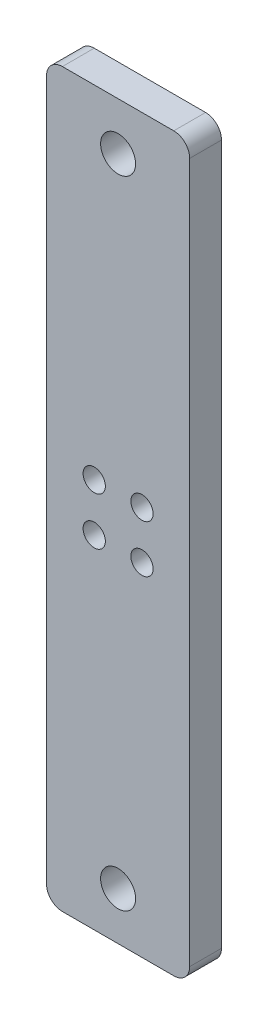
ISO-10303-21;
HEADER;
FILE_DESCRIPTION(('STEP AP214'),'2;1');
FILE_NAME('part.step','',(''),(''),'','','');
FILE_SCHEMA(('AUTOMOTIVE_DESIGN { 1 0 10303 214 1 1 1 1 }'));
ENDSEC;
DATA;
#1=APPLICATION_CONTEXT('core data for automotive mechanical design processes');
#2=APPLICATION_PROTOCOL_DEFINITION('international standard','automotive_design',2000,#1);
#3=PRODUCT_CONTEXT('',#1,'mechanical');
#4=PRODUCT('Part','Part','',(#3));
#5=PRODUCT_RELATED_PRODUCT_CATEGORY('part','',(#4));
#6=PRODUCT_DEFINITION_FORMATION('','',#4);
#7=PRODUCT_DEFINITION_CONTEXT('part definition',#1,'design');
#8=PRODUCT_DEFINITION('design','',#6,#7);
#9=PRODUCT_DEFINITION_SHAPE('','',#8);
#10=(LENGTH_UNIT() NAMED_UNIT(*) SI_UNIT(.MILLI.,.METRE.));
#11=(NAMED_UNIT(*) PLANE_ANGLE_UNIT() SI_UNIT($,.RADIAN.));
#12=(NAMED_UNIT(*) SI_UNIT($,.STERADIAN.) SOLID_ANGLE_UNIT());
#13=UNCERTAINTY_MEASURE_WITH_UNIT(LENGTH_MEASURE(1.E-05),#10,'distance_accuracy_value','');
#14=(GEOMETRIC_REPRESENTATION_CONTEXT(3) GLOBAL_UNCERTAINTY_ASSIGNED_CONTEXT((#13)) GLOBAL_UNIT_ASSIGNED_CONTEXT((#10,
#11,#12)) REPRESENTATION_CONTEXT('',''));
#15=CARTESIAN_POINT('',(0.,0.,0.));
#16=DIRECTION('',(0.,0.,1.));
#17=DIRECTION('',(1.,0.,0.));
#18=AXIS2_PLACEMENT_3D('',#15,#16,#17);
#19=CARTESIAN_POINT('',(22.5,115.,-10.));
#20=DIRECTION('',(1.,0.,0.));
#21=DIRECTION('',(0.,1.,0.));
#22=AXIS2_PLACEMENT_3D('',#19,#20,#21);
#23=PLANE('',#22);
#24=DIRECTION('',(0.,1.,0.));
#25=VECTOR('',#24,1.);
#26=CARTESIAN_POINT('',(22.5,115.,-10.));
#27=LINE('',#26,#25);
#28=CARTESIAN_POINT('',(22.5,-110.,-10.));
#29=VERTEX_POINT('',#28);
#30=CARTESIAN_POINT('',(22.5,110.,-10.));
#31=VERTEX_POINT('',#30);
#32=EDGE_CURVE('E170',#29,#31,#27,.T.);
#33=ORIENTED_EDGE('',*,*,#32,.T.);
#34=DIRECTION('',(0.,0.,1.));
#35=VECTOR('',#34,1.);
#36=CARTESIAN_POINT('',(22.5,110.,-10.));
#37=LINE('',#36,#35);
#38=CARTESIAN_POINT('',(22.5,110.,0.));
#39=VERTEX_POINT('',#38);
#40=EDGE_CURVE('E125',#31,#39,#37,.T.);
#41=ORIENTED_EDGE('',*,*,#40,.T.);
#42=DIRECTION('',(0.,1.,0.));
#43=VECTOR('',#42,1.);
#44=CARTESIAN_POINT('',(22.5,115.,0.));
#45=LINE('',#44,#43);
#46=CARTESIAN_POINT('',(22.5,-110.,0.));
#47=VERTEX_POINT('',#46);
#48=EDGE_CURVE('E110',#47,#39,#45,.T.);
#49=ORIENTED_EDGE('',*,*,#48,.F.);
#50=DIRECTION('',(0.,0.,1.));
#51=VECTOR('',#50,1.);
#52=CARTESIAN_POINT('',(22.5,-110.,-10.));
#53=LINE('',#52,#51);
#54=EDGE_CURVE('E122',#47,#29,#53,.F.);
#55=ORIENTED_EDGE('',*,*,#54,.T.);
#56=EDGE_LOOP('',(#33,#41,#49,#55));
#57=FACE_BOUND('',#56,.T.);
#58=ADVANCED_FACE('F40',(#57),#23,.T.);
#59=CARTESIAN_POINT('',(-22.5,-115.,-10.));
#60=DIRECTION('',(0.,-1.,0.));
#61=DIRECTION('',(0.,0.,-1.));
#62=AXIS2_PLACEMENT_3D('',#59,#60,#61);
#63=PLANE('',#62);
#64=DIRECTION('',(1.,0.,0.));
#65=VECTOR('',#64,1.);
#66=CARTESIAN_POINT('',(-22.5,-115.,-10.));
#67=LINE('',#66,#65);
#68=CARTESIAN_POINT('',(-17.5,-115.,-10.));
#69=VERTEX_POINT('',#68);
#70=CARTESIAN_POINT('',(17.5,-115.,-10.));
#71=VERTEX_POINT('',#70);
#72=EDGE_CURVE('E132',#69,#71,#67,.T.);
#73=ORIENTED_EDGE('',*,*,#72,.T.);
#74=DIRECTION('',(0.,0.,1.));
#75=VECTOR('',#74,1.);
#76=CARTESIAN_POINT('',(17.5,-115.,-10.));
#77=LINE('',#76,#75);
#78=CARTESIAN_POINT('',(17.5,-115.,0.));
#79=VERTEX_POINT('',#78);
#80=EDGE_CURVE('E11',#71,#79,#77,.T.);
#81=ORIENTED_EDGE('',*,*,#80,.T.);
#82=DIRECTION('',(1.,0.,0.));
#83=VECTOR('',#82,1.);
#84=CARTESIAN_POINT('',(-22.5,-115.,0.));
#85=LINE('',#84,#83);
#86=CARTESIAN_POINT('',(-17.5,-115.,0.));
#87=VERTEX_POINT('',#86);
#88=EDGE_CURVE('E112',#87,#79,#85,.T.);
#89=ORIENTED_EDGE('',*,*,#88,.F.);
#90=DIRECTION('',(0.,0.,1.));
#91=VECTOR('',#90,1.);
#92=CARTESIAN_POINT('',(-17.5,-115.,-10.));
#93=LINE('',#92,#91);
#94=EDGE_CURVE('E48',#87,#69,#93,.F.);
#95=ORIENTED_EDGE('',*,*,#94,.T.);
#96=EDGE_LOOP('',(#73,#81,#89,#95));
#97=FACE_BOUND('',#96,.T.);
#98=ADVANCED_FACE('F161',(#97),#63,.T.);
#99=CARTESIAN_POINT('',(-22.5,115.,-10.));
#100=DIRECTION('',(-1.,0.,0.));
#101=DIRECTION('',(0.,-1.,0.));
#102=AXIS2_PLACEMENT_3D('',#99,#100,#101);
#103=PLANE('',#102);
#104=DIRECTION('',(0.,-1.,0.));
#105=VECTOR('',#104,1.);
#106=CARTESIAN_POINT('',(-22.5,115.,0.));
#107=LINE('',#106,#105);
#108=CARTESIAN_POINT('',(-22.5,110.,0.));
#109=VERTEX_POINT('',#108);
#110=CARTESIAN_POINT('',(-22.5,-110.,0.));
#111=VERTEX_POINT('',#110);
#112=EDGE_CURVE('E168',#109,#111,#107,.T.);
#113=ORIENTED_EDGE('',*,*,#112,.F.);
#114=DIRECTION('',(0.,0.,1.));
#115=VECTOR('',#114,1.);
#116=CARTESIAN_POINT('',(-22.5,110.,-10.));
#117=LINE('',#116,#115);
#118=CARTESIAN_POINT('',(-22.5,110.,-10.));
#119=VERTEX_POINT('',#118);
#120=EDGE_CURVE('E62',#109,#119,#117,.F.);
#121=ORIENTED_EDGE('',*,*,#120,.T.);
#122=DIRECTION('',(0.,-1.,0.));
#123=VECTOR('',#122,1.);
#124=CARTESIAN_POINT('',(-22.5,115.,-10.));
#125=LINE('',#124,#123);
#126=CARTESIAN_POINT('',(-22.5,-110.,-10.));
#127=VERTEX_POINT('',#126);
#128=EDGE_CURVE('E136',#119,#127,#125,.T.);
#129=ORIENTED_EDGE('',*,*,#128,.T.);
#130=DIRECTION('',(0.,0.,1.));
#131=VECTOR('',#130,1.);
#132=CARTESIAN_POINT('',(-22.5,-110.,-10.));
#133=LINE('',#132,#131);
#134=EDGE_CURVE('E156',#127,#111,#133,.T.);
#135=ORIENTED_EDGE('',*,*,#134,.T.);
#136=EDGE_LOOP('',(#113,#121,#129,#135));
#137=FACE_BOUND('',#136,.T.);
#138=ADVANCED_FACE('F167',(#137),#103,.T.);
#139=CARTESIAN_POINT('',(-22.5,115.,-10.));
#140=DIRECTION('',(0.,1.,0.));
#141=DIRECTION('',(0.,0.,1.));
#142=AXIS2_PLACEMENT_3D('',#139,#140,#141);
#143=PLANE('',#142);
#144=DIRECTION('',(-1.,0.,0.));
#145=VECTOR('',#144,1.);
#146=CARTESIAN_POINT('',(-22.5,115.,0.));
#147=LINE('',#146,#145);
#148=CARTESIAN_POINT('',(17.5,115.,0.));
#149=VERTEX_POINT('',#148);
#150=CARTESIAN_POINT('',(-17.5,115.,0.));
#151=VERTEX_POINT('',#150);
#152=EDGE_CURVE('E126',#149,#151,#147,.T.);
#153=ORIENTED_EDGE('',*,*,#152,.F.);
#154=DIRECTION('',(0.,0.,1.));
#155=VECTOR('',#154,1.);
#156=CARTESIAN_POINT('',(17.5,115.,-10.));
#157=LINE('',#156,#155);
#158=CARTESIAN_POINT('',(17.5,115.,-10.));
#159=VERTEX_POINT('',#158);
#160=EDGE_CURVE('E148',#149,#159,#157,.F.);
#161=ORIENTED_EDGE('',*,*,#160,.T.);
#162=DIRECTION('',(-1.,0.,0.));
#163=VECTOR('',#162,1.);
#164=CARTESIAN_POINT('',(-22.5,115.,-10.));
#165=LINE('',#164,#163);
#166=CARTESIAN_POINT('',(-17.5,115.,-10.));
#167=VERTEX_POINT('',#166);
#168=EDGE_CURVE('E174',#159,#167,#165,.T.);
#169=ORIENTED_EDGE('',*,*,#168,.T.);
#170=DIRECTION('',(0.,0.,1.));
#171=VECTOR('',#170,1.);
#172=CARTESIAN_POINT('',(-17.5,115.,-10.));
#173=LINE('',#172,#171);
#174=EDGE_CURVE('E145',#167,#151,#173,.T.);
#175=ORIENTED_EDGE('',*,*,#174,.T.);
#176=EDGE_LOOP('',(#153,#161,#169,#175));
#177=FACE_BOUND('',#176,.T.);
#178=ADVANCED_FACE('F245',(#177),#143,.T.);
#179=CARTESIAN_POINT('',(0.,0.,-10.));
#180=DIRECTION('',(0.,0.,1.));
#181=DIRECTION('',(1.,0.,0.));
#182=AXIS2_PLACEMENT_3D('',#179,#180,#181);
#183=PLANE('',#182);
#184=CARTESIAN_POINT('',(0.,-100.,-10.));
#185=DIRECTION('',(0.,0.,1.));
#186=DIRECTION('',(1.,0.,0.));
#187=AXIS2_PLACEMENT_3D('',#184,#185,#186);
#188=CIRCLE('',#187,5.5);
#189=CARTESIAN_POINT('',(5.5,-100.,-10.));
#190=VERTEX_POINT('',#189);
#191=EDGE_CURVE('E201',#190,#190,#188,.T.);
#192=ORIENTED_EDGE('',*,*,#191,.T.);
#193=EDGE_LOOP('',(#192));
#194=FACE_BOUND('',#193,.T.);
#195=CARTESIAN_POINT('',(0.,100.,-10.));
#196=DIRECTION('',(0.,0.,1.));
#197=DIRECTION('',(1.,0.,0.));
#198=AXIS2_PLACEMENT_3D('',#195,#196,#197);
#199=CIRCLE('',#198,5.5);
#200=CARTESIAN_POINT('',(5.5,100.,-10.));
#201=VERTEX_POINT('',#200);
#202=EDGE_CURVE('E205',#201,#201,#199,.T.);
#203=ORIENTED_EDGE('',*,*,#202,.T.);
#204=EDGE_LOOP('',(#203));
#205=FACE_BOUND('',#204,.T.);
#206=CARTESIAN_POINT('',(-7.5,7.5,-10.));
#207=DIRECTION('',(0.,0.,1.));
#208=DIRECTION('',(1.,0.,0.));
#209=AXIS2_PLACEMENT_3D('',#206,#207,#208);
#210=CIRCLE('',#209,3.5);
#211=CARTESIAN_POINT('',(-4.,7.5,-10.));
#212=VERTEX_POINT('',#211);
#213=EDGE_CURVE('E127',#212,#212,#210,.T.);
#214=ORIENTED_EDGE('',*,*,#213,.T.);
#215=EDGE_LOOP('',(#214));
#216=FACE_BOUND('',#215,.T.);
#217=CARTESIAN_POINT('',(7.5,-7.5,-10.));
#218=DIRECTION('',(0.,0.,1.));
#219=DIRECTION('',(1.,0.,0.));
#220=AXIS2_PLACEMENT_3D('',#217,#218,#219);
#221=CIRCLE('',#220,3.5);
#222=CARTESIAN_POINT('',(11.,-7.5,-10.));
#223=VERTEX_POINT('',#222);
#224=EDGE_CURVE('E180',#223,#223,#221,.T.);
#225=ORIENTED_EDGE('',*,*,#224,.T.);
#226=EDGE_LOOP('',(#225));
#227=FACE_BOUND('',#226,.T.);
#228=CARTESIAN_POINT('',(-7.5,-7.5,-10.));
#229=DIRECTION('',(0.,0.,1.));
#230=DIRECTION('',(1.,0.,0.));
#231=AXIS2_PLACEMENT_3D('',#228,#229,#230);
#232=CIRCLE('',#231,3.5);
#233=CARTESIAN_POINT('',(-4.,-7.5,-10.));
#234=VERTEX_POINT('',#233);
#235=EDGE_CURVE('E183',#234,#234,#232,.T.);
#236=ORIENTED_EDGE('',*,*,#235,.T.);
#237=EDGE_LOOP('',(#236));
#238=FACE_BOUND('',#237,.T.);
#239=CARTESIAN_POINT('',(7.5,7.5,-10.));
#240=DIRECTION('',(0.,0.,1.));
#241=DIRECTION('',(1.,0.,0.));
#242=AXIS2_PLACEMENT_3D('',#239,#240,#241);
#243=CIRCLE('',#242,3.5);
#244=CARTESIAN_POINT('',(11.,7.5,-10.));
#245=VERTEX_POINT('',#244);
#246=EDGE_CURVE('E186',#245,#245,#243,.T.);
#247=ORIENTED_EDGE('',*,*,#246,.T.);
#248=EDGE_LOOP('',(#247));
#249=FACE_BOUND('',#248,.T.);
#250=ORIENTED_EDGE('',*,*,#168,.F.);
#251=CARTESIAN_POINT('',(17.5,110.,-10.));
#252=DIRECTION('',(0.,0.,1.));
#253=DIRECTION('',(1.,0.,0.));
#254=AXIS2_PLACEMENT_3D('',#251,#252,#253);
#255=CIRCLE('',#254,5.);
#256=EDGE_CURVE('E154',#159,#31,#255,.F.);
#257=ORIENTED_EDGE('',*,*,#256,.T.);
#258=ORIENTED_EDGE('',*,*,#32,.F.);
#259=CARTESIAN_POINT('',(17.5,-110.,-10.));
#260=DIRECTION('',(0.,0.,1.));
#261=DIRECTION('',(1.,0.,0.));
#262=AXIS2_PLACEMENT_3D('',#259,#260,#261);
#263=CIRCLE('',#262,5.);
#264=EDGE_CURVE('E131',#29,#71,#263,.F.);
#265=ORIENTED_EDGE('',*,*,#264,.T.);
#266=ORIENTED_EDGE('',*,*,#72,.F.);
#267=CARTESIAN_POINT('',(-17.5,-110.,-10.));
#268=DIRECTION('',(0.,0.,1.));
#269=DIRECTION('',(1.,0.,0.));
#270=AXIS2_PLACEMENT_3D('',#267,#268,#269);
#271=CIRCLE('',#270,5.);
#272=EDGE_CURVE('E55',#69,#127,#271,.F.);
#273=ORIENTED_EDGE('',*,*,#272,.T.);
#274=ORIENTED_EDGE('',*,*,#128,.F.);
#275=CARTESIAN_POINT('',(-17.5,110.,-10.));
#276=DIRECTION('',(0.,0.,1.));
#277=DIRECTION('',(1.,0.,0.));
#278=AXIS2_PLACEMENT_3D('',#275,#276,#277);
#279=CIRCLE('',#278,5.);
#280=EDGE_CURVE('E152',#119,#167,#279,.F.);
#281=ORIENTED_EDGE('',*,*,#280,.T.);
#282=EDGE_LOOP('',(#250,#257,#258,#265,#266,#273,#274,#281));
#283=FACE_BOUND('',#282,.T.);
#284=ADVANCED_FACE('F164',(#194,#205,#216,#227,#238,#249,#283),#183,.F.);
#285=CARTESIAN_POINT('',(0.,0.,0.));
#286=DIRECTION('',(0.,0.,1.));
#287=DIRECTION('',(1.,0.,0.));
#288=AXIS2_PLACEMENT_3D('',#285,#286,#287);
#289=PLANE('',#288);
#290=CARTESIAN_POINT('',(0.,-100.,0.));
#291=DIRECTION('',(0.,0.,1.));
#292=DIRECTION('',(1.,0.,0.));
#293=AXIS2_PLACEMENT_3D('',#290,#291,#292);
#294=CIRCLE('',#293,5.5);
#295=CARTESIAN_POINT('',(5.5,-100.,0.));
#296=VERTEX_POINT('',#295);
#297=EDGE_CURVE('E208',#296,#296,#294,.T.);
#298=ORIENTED_EDGE('',*,*,#297,.F.);
#299=EDGE_LOOP('',(#298));
#300=FACE_BOUND('',#299,.T.);
#301=CARTESIAN_POINT('',(0.,100.,0.));
#302=DIRECTION('',(0.,0.,1.));
#303=DIRECTION('',(1.,0.,0.));
#304=AXIS2_PLACEMENT_3D('',#301,#302,#303);
#305=CIRCLE('',#304,5.5);
#306=CARTESIAN_POINT('',(5.5,100.,0.));
#307=VERTEX_POINT('',#306);
#308=EDGE_CURVE('E202',#307,#307,#305,.T.);
#309=ORIENTED_EDGE('',*,*,#308,.F.);
#310=EDGE_LOOP('',(#309));
#311=FACE_BOUND('',#310,.T.);
#312=CARTESIAN_POINT('',(-7.5,7.5,0.));
#313=DIRECTION('',(0.,0.,1.));
#314=DIRECTION('',(1.,0.,0.));
#315=AXIS2_PLACEMENT_3D('',#312,#313,#314);
#316=CIRCLE('',#315,3.5);
#317=CARTESIAN_POINT('',(-4.,7.5,0.));
#318=VERTEX_POINT('',#317);
#319=EDGE_CURVE('E192',#318,#318,#316,.T.);
#320=ORIENTED_EDGE('',*,*,#319,.F.);
#321=EDGE_LOOP('',(#320));
#322=FACE_BOUND('',#321,.T.);
#323=CARTESIAN_POINT('',(7.5,-7.5,0.));
#324=DIRECTION('',(0.,0.,1.));
#325=DIRECTION('',(1.,0.,0.));
#326=AXIS2_PLACEMENT_3D('',#323,#324,#325);
#327=CIRCLE('',#326,3.5);
#328=CARTESIAN_POINT('',(11.,-7.5,0.));
#329=VERTEX_POINT('',#328);
#330=EDGE_CURVE('E193',#329,#329,#327,.T.);
#331=ORIENTED_EDGE('',*,*,#330,.F.);
#332=EDGE_LOOP('',(#331));
#333=FACE_BOUND('',#332,.T.);
#334=CARTESIAN_POINT('',(-7.5,-7.5,0.));
#335=DIRECTION('',(0.,0.,1.));
#336=DIRECTION('',(1.,0.,0.));
#337=AXIS2_PLACEMENT_3D('',#334,#335,#336);
#338=CIRCLE('',#337,3.5);
#339=CARTESIAN_POINT('',(-4.,-7.5,0.));
#340=VERTEX_POINT('',#339);
#341=EDGE_CURVE('E196',#340,#340,#338,.T.);
#342=ORIENTED_EDGE('',*,*,#341,.F.);
#343=EDGE_LOOP('',(#342));
#344=FACE_BOUND('',#343,.T.);
#345=CARTESIAN_POINT('',(7.5,7.5,0.));
#346=DIRECTION('',(0.,0.,1.));
#347=DIRECTION('',(1.,0.,0.));
#348=AXIS2_PLACEMENT_3D('',#345,#346,#347);
#349=CIRCLE('',#348,3.5);
#350=CARTESIAN_POINT('',(11.,7.5,0.));
#351=VERTEX_POINT('',#350);
#352=EDGE_CURVE('E189',#351,#351,#349,.T.);
#353=ORIENTED_EDGE('',*,*,#352,.F.);
#354=EDGE_LOOP('',(#353));
#355=FACE_BOUND('',#354,.T.);
#356=ORIENTED_EDGE('',*,*,#48,.T.);
#357=CARTESIAN_POINT('',(17.5,110.,0.));
#358=DIRECTION('',(0.,0.,1.));
#359=DIRECTION('',(1.,0.,0.));
#360=AXIS2_PLACEMENT_3D('',#357,#358,#359);
#361=CIRCLE('',#360,5.);
#362=EDGE_CURVE('E143',#39,#149,#361,.T.);
#363=ORIENTED_EDGE('',*,*,#362,.T.);
#364=ORIENTED_EDGE('',*,*,#152,.T.);
#365=CARTESIAN_POINT('',(-17.5,110.,0.));
#366=DIRECTION('',(0.,0.,1.));
#367=DIRECTION('',(1.,0.,0.));
#368=AXIS2_PLACEMENT_3D('',#365,#366,#367);
#369=CIRCLE('',#368,5.);
#370=EDGE_CURVE('E116',#151,#109,#369,.T.);
#371=ORIENTED_EDGE('',*,*,#370,.T.);
#372=ORIENTED_EDGE('',*,*,#112,.T.);
#373=CARTESIAN_POINT('',(-17.5,-110.,0.));
#374=DIRECTION('',(0.,0.,1.));
#375=DIRECTION('',(1.,0.,0.));
#376=AXIS2_PLACEMENT_3D('',#373,#374,#375);
#377=CIRCLE('',#376,5.);
#378=EDGE_CURVE('E117',#111,#87,#377,.T.);
#379=ORIENTED_EDGE('',*,*,#378,.T.);
#380=ORIENTED_EDGE('',*,*,#88,.T.);
#381=CARTESIAN_POINT('',(17.5,-110.,0.));
#382=DIRECTION('',(0.,0.,1.));
#383=DIRECTION('',(1.,0.,0.));
#384=AXIS2_PLACEMENT_3D('',#381,#382,#383);
#385=CIRCLE('',#384,5.);
#386=EDGE_CURVE('E107',#79,#47,#385,.T.);
#387=ORIENTED_EDGE('',*,*,#386,.T.);
#388=EDGE_LOOP('',(#356,#363,#364,#371,#372,#379,#380,#387));
#389=FACE_BOUND('',#388,.T.);
#390=ADVANCED_FACE('F109',(#300,#311,#322,#333,#344,#355,#389),#289,.T.);
#391=CARTESIAN_POINT('',(7.5,7.5,-26.));
#392=DIRECTION('',(0.,0.,1.));
#393=DIRECTION('',(1.,0.,0.));
#394=AXIS2_PLACEMENT_3D('',#391,#392,#393);
#395=CYLINDRICAL_SURFACE('',#394,3.5);
#396=CARTESIAN_POINT('',(11.,7.5,0.));
#397=CARTESIAN_POINT('',(11.,7.5,-0.10416666666667));
#398=CARTESIAN_POINT('',(11.,7.5,-0.208333333333337));
#399=CARTESIAN_POINT('',(11.,7.5,-0.416666666666671));
#400=CARTESIAN_POINT('',(11.,7.5,-0.520833333333337));
#401=CARTESIAN_POINT('',(11.,7.5,-0.729166666666671));
#402=CARTESIAN_POINT('',(11.,7.5,-0.833333333333337));
#403=CARTESIAN_POINT('',(11.,7.5,-1.04166666666667));
#404=CARTESIAN_POINT('',(11.,7.5,-1.14583333333334));
#405=CARTESIAN_POINT('',(11.,7.5,-1.35416666666667));
#406=CARTESIAN_POINT('',(11.,7.5,-1.45833333333334));
#407=CARTESIAN_POINT('',(11.,7.5,-1.66666666666667));
#408=CARTESIAN_POINT('',(11.,7.5,-1.77083333333334));
#409=CARTESIAN_POINT('',(11.,7.5,-1.97916666666667));
#410=CARTESIAN_POINT('',(11.,7.5,-2.08333333333334));
#411=CARTESIAN_POINT('',(11.,7.5,-2.29166666666667));
#412=CARTESIAN_POINT('',(11.,7.5,-2.39583333333334));
#413=CARTESIAN_POINT('',(11.,7.5,-2.60416666666667));
#414=CARTESIAN_POINT('',(11.,7.5,-2.70833333333334));
#415=CARTESIAN_POINT('',(11.,7.5,-2.91666666666667));
#416=CARTESIAN_POINT('',(11.,7.5,-3.02083333333334));
#417=CARTESIAN_POINT('',(11.,7.5,-3.22916666666667));
#418=CARTESIAN_POINT('',(11.,7.5,-3.33333333333334));
#419=CARTESIAN_POINT('',(11.,7.5,-3.54166666666667));
#420=CARTESIAN_POINT('',(11.,7.5,-3.64583333333334));
#421=CARTESIAN_POINT('',(11.,7.5,-3.85416666666667));
#422=CARTESIAN_POINT('',(11.,7.5,-3.95833333333334));
#423=CARTESIAN_POINT('',(11.,7.5,-4.16666666666667));
#424=CARTESIAN_POINT('',(11.,7.5,-4.27083333333334));
#425=CARTESIAN_POINT('',(11.,7.5,-4.47916666666667));
#426=CARTESIAN_POINT('',(11.,7.5,-4.58333333333334));
#427=CARTESIAN_POINT('',(11.,7.5,-4.79166666666667));
#428=CARTESIAN_POINT('',(11.,7.5,-4.89583333333334));
#429=CARTESIAN_POINT('',(11.,7.5,-5.10416666666667));
#430=CARTESIAN_POINT('',(11.,7.5,-5.20833333333334));
#431=CARTESIAN_POINT('',(11.,7.5,-5.41666666666667));
#432=CARTESIAN_POINT('',(11.,7.5,-5.52083333333334));
#433=CARTESIAN_POINT('',(11.,7.5,-5.72916666666667));
#434=CARTESIAN_POINT('',(11.,7.5,-5.83333333333334));
#435=CARTESIAN_POINT('',(11.,7.5,-6.04166666666667));
#436=CARTESIAN_POINT('',(11.,7.5,-6.14583333333334));
#437=CARTESIAN_POINT('',(11.,7.5,-6.35416666666667));
#438=CARTESIAN_POINT('',(11.,7.5,-6.45833333333334));
#439=CARTESIAN_POINT('',(11.,7.5,-6.66666666666667));
#440=CARTESIAN_POINT('',(11.,7.5,-6.77083333333334));
#441=CARTESIAN_POINT('',(11.,7.5,-6.97916666666667));
#442=CARTESIAN_POINT('',(11.,7.5,-7.08333333333334));
#443=CARTESIAN_POINT('',(11.,7.5,-7.29166666666667));
#444=CARTESIAN_POINT('',(11.,7.5,-7.39583333333334));
#445=CARTESIAN_POINT('',(11.,7.5,-7.60416666666667));
#446=CARTESIAN_POINT('',(11.,7.5,-7.70833333333334));
#447=CARTESIAN_POINT('',(11.,7.5,-7.91666666666667));
#448=CARTESIAN_POINT('',(11.,7.5,-8.02083333333334));
#449=CARTESIAN_POINT('',(11.,7.5,-8.22916666666667));
#450=CARTESIAN_POINT('',(11.,7.5,-8.33333333333334));
#451=CARTESIAN_POINT('',(11.,7.5,-8.54166666666667));
#452=CARTESIAN_POINT('',(11.,7.5,-8.64583333333334));
#453=CARTESIAN_POINT('',(11.,7.5,-8.85416666666667));
#454=CARTESIAN_POINT('',(11.,7.5,-8.95833333333334));
#455=CARTESIAN_POINT('',(11.,7.5,-9.16666666666667));
#456=CARTESIAN_POINT('',(11.,7.5,-9.27083333333334));
#457=CARTESIAN_POINT('',(11.,7.5,-9.47916666666667));
#458=CARTESIAN_POINT('',(11.,7.5,-9.58333333333334));
#459=CARTESIAN_POINT('',(11.,7.5,-9.79166666666667));
#460=CARTESIAN_POINT('',(11.,7.5,-9.89583333333334));
#461=CARTESIAN_POINT('',(11.,7.5,-10.));
#462=B_SPLINE_CURVE_WITH_KNOTS('',3,(#396,#397,#398,#399,#400,#401,#402,#403,#404,#405,#406,
#407,#408,#409,#410,#411,#412,#413,#414,#415,#416,#417,#418,#419,#420,#421,#422,#423,#424,#425,
#426,#427,#428,#429,#430,#431,#432,#433,#434,#435,#436,#437,#438,#439,#440,#441,#442,#443,#444,
#445,#446,#447,#448,#449,#450,#451,#452,#453,#454,#455,#456,#457,#458,#459,#460,#461),
.UNSPECIFIED.,.F.,.F.,(4,2,2,2,2,2,2,2,2,2,2,2,2,2,2,2,2,2,2,2,2,2,2,2,2,2,2,2,2,2,2,2,4),(0.,
0.3125,0.625000000000001,0.937500000000001,1.25,1.5625,1.875,2.1875,2.5,2.8125,3.125,3.4375,
3.75,4.0625,4.375,4.6875,5.,5.3125,5.625,5.9375,6.25,6.5625,6.875,7.1875,7.5,7.8125,8.125,
8.4375,8.75,9.0625,9.375,9.6875,10.),.UNSPECIFIED.);
#463=EDGE_CURVE('BSEAM226',#351,#245,#462,.T.);
#464=ORIENTED_EDGE('',*,*,#352,.T.);
#465=ORIENTED_EDGE('',*,*,#246,.F.);
#466=ORIENTED_EDGE('',*,*,#463,.T.);
#467=ORIENTED_EDGE('',*,*,#463,.F.);
#468=EDGE_LOOP('',(#464,#466,#465,#467));
#469=FACE_BOUND('',#468,.T.);
#470=ADVANCED_FACE('F226',(#469),#395,.F.);
#471=CARTESIAN_POINT('',(-7.5,-7.5,-26.));
#472=DIRECTION('',(0.,0.,1.));
#473=DIRECTION('',(1.,0.,0.));
#474=AXIS2_PLACEMENT_3D('',#471,#472,#473);
#475=CYLINDRICAL_SURFACE('',#474,3.5);
#476=CARTESIAN_POINT('',(-4.,-7.5,0.));
#477=CARTESIAN_POINT('',(-4.,-7.5,-0.10416666666667));
#478=CARTESIAN_POINT('',(-4.,-7.5,-0.208333333333337));
#479=CARTESIAN_POINT('',(-4.,-7.5,-0.416666666666671));
#480=CARTESIAN_POINT('',(-4.,-7.5,-0.520833333333337));
#481=CARTESIAN_POINT('',(-4.,-7.5,-0.729166666666671));
#482=CARTESIAN_POINT('',(-4.,-7.5,-0.833333333333337));
#483=CARTESIAN_POINT('',(-4.,-7.5,-1.04166666666667));
#484=CARTESIAN_POINT('',(-4.,-7.5,-1.14583333333334));
#485=CARTESIAN_POINT('',(-4.,-7.5,-1.35416666666667));
#486=CARTESIAN_POINT('',(-4.,-7.5,-1.45833333333334));
#487=CARTESIAN_POINT('',(-4.,-7.5,-1.66666666666667));
#488=CARTESIAN_POINT('',(-4.,-7.5,-1.77083333333334));
#489=CARTESIAN_POINT('',(-4.,-7.5,-1.97916666666667));
#490=CARTESIAN_POINT('',(-4.,-7.5,-2.08333333333334));
#491=CARTESIAN_POINT('',(-4.,-7.5,-2.29166666666667));
#492=CARTESIAN_POINT('',(-4.,-7.5,-2.39583333333334));
#493=CARTESIAN_POINT('',(-4.,-7.5,-2.60416666666667));
#494=CARTESIAN_POINT('',(-4.,-7.5,-2.70833333333334));
#495=CARTESIAN_POINT('',(-4.,-7.5,-2.91666666666667));
#496=CARTESIAN_POINT('',(-4.,-7.5,-3.02083333333334));
#497=CARTESIAN_POINT('',(-4.,-7.5,-3.22916666666667));
#498=CARTESIAN_POINT('',(-4.,-7.5,-3.33333333333334));
#499=CARTESIAN_POINT('',(-4.,-7.5,-3.54166666666667));
#500=CARTESIAN_POINT('',(-4.,-7.5,-3.64583333333334));
#501=CARTESIAN_POINT('',(-4.,-7.5,-3.85416666666667));
#502=CARTESIAN_POINT('',(-4.,-7.5,-3.95833333333334));
#503=CARTESIAN_POINT('',(-4.,-7.5,-4.16666666666667));
#504=CARTESIAN_POINT('',(-4.,-7.5,-4.27083333333334));
#505=CARTESIAN_POINT('',(-4.,-7.5,-4.47916666666667));
#506=CARTESIAN_POINT('',(-4.,-7.5,-4.58333333333334));
#507=CARTESIAN_POINT('',(-4.,-7.5,-4.79166666666667));
#508=CARTESIAN_POINT('',(-4.,-7.5,-4.89583333333334));
#509=CARTESIAN_POINT('',(-4.,-7.5,-5.10416666666667));
#510=CARTESIAN_POINT('',(-4.,-7.5,-5.20833333333334));
#511=CARTESIAN_POINT('',(-4.,-7.5,-5.41666666666667));
#512=CARTESIAN_POINT('',(-4.,-7.5,-5.52083333333334));
#513=CARTESIAN_POINT('',(-4.,-7.5,-5.72916666666667));
#514=CARTESIAN_POINT('',(-4.,-7.5,-5.83333333333334));
#515=CARTESIAN_POINT('',(-4.,-7.5,-6.04166666666667));
#516=CARTESIAN_POINT('',(-4.,-7.5,-6.14583333333334));
#517=CARTESIAN_POINT('',(-4.,-7.5,-6.35416666666667));
#518=CARTESIAN_POINT('',(-4.,-7.5,-6.45833333333334));
#519=CARTESIAN_POINT('',(-4.,-7.5,-6.66666666666667));
#520=CARTESIAN_POINT('',(-4.,-7.5,-6.77083333333334));
#521=CARTESIAN_POINT('',(-4.,-7.5,-6.97916666666667));
#522=CARTESIAN_POINT('',(-4.,-7.5,-7.08333333333334));
#523=CARTESIAN_POINT('',(-4.,-7.5,-7.29166666666667));
#524=CARTESIAN_POINT('',(-4.,-7.5,-7.39583333333334));
#525=CARTESIAN_POINT('',(-4.,-7.5,-7.60416666666667));
#526=CARTESIAN_POINT('',(-4.,-7.5,-7.70833333333334));
#527=CARTESIAN_POINT('',(-4.,-7.5,-7.91666666666667));
#528=CARTESIAN_POINT('',(-4.,-7.5,-8.02083333333334));
#529=CARTESIAN_POINT('',(-4.,-7.5,-8.22916666666667));
#530=CARTESIAN_POINT('',(-4.,-7.5,-8.33333333333334));
#531=CARTESIAN_POINT('',(-4.,-7.5,-8.54166666666667));
#532=CARTESIAN_POINT('',(-4.,-7.5,-8.64583333333334));
#533=CARTESIAN_POINT('',(-4.,-7.5,-8.85416666666667));
#534=CARTESIAN_POINT('',(-4.,-7.5,-8.95833333333334));
#535=CARTESIAN_POINT('',(-4.,-7.5,-9.16666666666667));
#536=CARTESIAN_POINT('',(-4.,-7.5,-9.27083333333334));
#537=CARTESIAN_POINT('',(-4.,-7.5,-9.47916666666667));
#538=CARTESIAN_POINT('',(-4.,-7.5,-9.58333333333334));
#539=CARTESIAN_POINT('',(-4.,-7.5,-9.79166666666667));
#540=CARTESIAN_POINT('',(-4.,-7.5,-9.89583333333334));
#541=CARTESIAN_POINT('',(-4.,-7.5,-10.));
#542=B_SPLINE_CURVE_WITH_KNOTS('',3,(#476,#477,#478,#479,#480,#481,#482,#483,#484,#485,#486,
#487,#488,#489,#490,#491,#492,#493,#494,#495,#496,#497,#498,#499,#500,#501,#502,#503,#504,#505,
#506,#507,#508,#509,#510,#511,#512,#513,#514,#515,#516,#517,#518,#519,#520,#521,#522,#523,#524,
#525,#526,#527,#528,#529,#530,#531,#532,#533,#534,#535,#536,#537,#538,#539,#540,#541),
.UNSPECIFIED.,.F.,.F.,(4,2,2,2,2,2,2,2,2,2,2,2,2,2,2,2,2,2,2,2,2,2,2,2,2,2,2,2,2,2,2,2,4),(0.,
0.3125,0.625000000000001,0.937500000000001,1.25,1.5625,1.875,2.1875,2.5,2.8125,3.125,3.4375,
3.75,4.0625,4.375,4.6875,5.,5.3125,5.625,5.9375,6.25,6.5625,6.875,7.1875,7.5,7.8125,8.125,
8.4375,8.75,9.0625,9.375,9.6875,10.),.UNSPECIFIED.);
#543=EDGE_CURVE('BSEAM240',#340,#234,#542,.T.);
#544=ORIENTED_EDGE('',*,*,#341,.T.);
#545=ORIENTED_EDGE('',*,*,#235,.F.);
#546=ORIENTED_EDGE('',*,*,#543,.T.);
#547=ORIENTED_EDGE('',*,*,#543,.F.);
#548=EDGE_LOOP('',(#544,#546,#545,#547));
#549=FACE_BOUND('',#548,.T.);
#550=ADVANCED_FACE('F240',(#549),#475,.F.);
#551=CARTESIAN_POINT('',(7.5,-7.5,-26.));
#552=DIRECTION('',(0.,0.,1.));
#553=DIRECTION('',(1.,0.,0.));
#554=AXIS2_PLACEMENT_3D('',#551,#552,#553);
#555=CYLINDRICAL_SURFACE('',#554,3.5);
#556=CARTESIAN_POINT('',(11.,-7.5,0.));
#557=CARTESIAN_POINT('',(11.,-7.5,-0.10416666666667));
#558=CARTESIAN_POINT('',(11.,-7.5,-0.208333333333337));
#559=CARTESIAN_POINT('',(11.,-7.5,-0.416666666666671));
#560=CARTESIAN_POINT('',(11.,-7.5,-0.520833333333337));
#561=CARTESIAN_POINT('',(11.,-7.5,-0.729166666666671));
#562=CARTESIAN_POINT('',(11.,-7.5,-0.833333333333337));
#563=CARTESIAN_POINT('',(11.,-7.5,-1.04166666666667));
#564=CARTESIAN_POINT('',(11.,-7.5,-1.14583333333334));
#565=CARTESIAN_POINT('',(11.,-7.5,-1.35416666666667));
#566=CARTESIAN_POINT('',(11.,-7.5,-1.45833333333334));
#567=CARTESIAN_POINT('',(11.,-7.5,-1.66666666666667));
#568=CARTESIAN_POINT('',(11.,-7.5,-1.77083333333334));
#569=CARTESIAN_POINT('',(11.,-7.5,-1.97916666666667));
#570=CARTESIAN_POINT('',(11.,-7.5,-2.08333333333334));
#571=CARTESIAN_POINT('',(11.,-7.5,-2.29166666666667));
#572=CARTESIAN_POINT('',(11.,-7.5,-2.39583333333334));
#573=CARTESIAN_POINT('',(11.,-7.5,-2.60416666666667));
#574=CARTESIAN_POINT('',(11.,-7.5,-2.70833333333334));
#575=CARTESIAN_POINT('',(11.,-7.5,-2.91666666666667));
#576=CARTESIAN_POINT('',(11.,-7.5,-3.02083333333334));
#577=CARTESIAN_POINT('',(11.,-7.5,-3.22916666666667));
#578=CARTESIAN_POINT('',(11.,-7.5,-3.33333333333334));
#579=CARTESIAN_POINT('',(11.,-7.5,-3.54166666666667));
#580=CARTESIAN_POINT('',(11.,-7.5,-3.64583333333334));
#581=CARTESIAN_POINT('',(11.,-7.5,-3.85416666666667));
#582=CARTESIAN_POINT('',(11.,-7.5,-3.95833333333334));
#583=CARTESIAN_POINT('',(11.,-7.5,-4.16666666666667));
#584=CARTESIAN_POINT('',(11.,-7.5,-4.27083333333334));
#585=CARTESIAN_POINT('',(11.,-7.5,-4.47916666666667));
#586=CARTESIAN_POINT('',(11.,-7.5,-4.58333333333334));
#587=CARTESIAN_POINT('',(11.,-7.5,-4.79166666666667));
#588=CARTESIAN_POINT('',(11.,-7.5,-4.89583333333334));
#589=CARTESIAN_POINT('',(11.,-7.5,-5.10416666666667));
#590=CARTESIAN_POINT('',(11.,-7.5,-5.20833333333334));
#591=CARTESIAN_POINT('',(11.,-7.5,-5.41666666666667));
#592=CARTESIAN_POINT('',(11.,-7.5,-5.52083333333334));
#593=CARTESIAN_POINT('',(11.,-7.5,-5.72916666666667));
#594=CARTESIAN_POINT('',(11.,-7.5,-5.83333333333334));
#595=CARTESIAN_POINT('',(11.,-7.5,-6.04166666666667));
#596=CARTESIAN_POINT('',(11.,-7.5,-6.14583333333334));
#597=CARTESIAN_POINT('',(11.,-7.5,-6.35416666666667));
#598=CARTESIAN_POINT('',(11.,-7.5,-6.45833333333334));
#599=CARTESIAN_POINT('',(11.,-7.5,-6.66666666666667));
#600=CARTESIAN_POINT('',(11.,-7.5,-6.77083333333334));
#601=CARTESIAN_POINT('',(11.,-7.5,-6.97916666666667));
#602=CARTESIAN_POINT('',(11.,-7.5,-7.08333333333334));
#603=CARTESIAN_POINT('',(11.,-7.5,-7.29166666666667));
#604=CARTESIAN_POINT('',(11.,-7.5,-7.39583333333334));
#605=CARTESIAN_POINT('',(11.,-7.5,-7.60416666666667));
#606=CARTESIAN_POINT('',(11.,-7.5,-7.70833333333334));
#607=CARTESIAN_POINT('',(11.,-7.5,-7.91666666666667));
#608=CARTESIAN_POINT('',(11.,-7.5,-8.02083333333334));
#609=CARTESIAN_POINT('',(11.,-7.5,-8.22916666666667));
#610=CARTESIAN_POINT('',(11.,-7.5,-8.33333333333334));
#611=CARTESIAN_POINT('',(11.,-7.5,-8.54166666666667));
#612=CARTESIAN_POINT('',(11.,-7.5,-8.64583333333334));
#613=CARTESIAN_POINT('',(11.,-7.5,-8.85416666666667));
#614=CARTESIAN_POINT('',(11.,-7.5,-8.95833333333334));
#615=CARTESIAN_POINT('',(11.,-7.5,-9.16666666666667));
#616=CARTESIAN_POINT('',(11.,-7.5,-9.27083333333334));
#617=CARTESIAN_POINT('',(11.,-7.5,-9.47916666666667));
#618=CARTESIAN_POINT('',(11.,-7.5,-9.58333333333334));
#619=CARTESIAN_POINT('',(11.,-7.5,-9.79166666666667));
#620=CARTESIAN_POINT('',(11.,-7.5,-9.89583333333334));
#621=CARTESIAN_POINT('',(11.,-7.5,-10.));
#622=B_SPLINE_CURVE_WITH_KNOTS('',3,(#556,#557,#558,#559,#560,#561,#562,#563,#564,#565,#566,
#567,#568,#569,#570,#571,#572,#573,#574,#575,#576,#577,#578,#579,#580,#581,#582,#583,#584,#585,
#586,#587,#588,#589,#590,#591,#592,#593,#594,#595,#596,#597,#598,#599,#600,#601,#602,#603,#604,
#605,#606,#607,#608,#609,#610,#611,#612,#613,#614,#615,#616,#617,#618,#619,#620,#621),
.UNSPECIFIED.,.F.,.F.,(4,2,2,2,2,2,2,2,2,2,2,2,2,2,2,2,2,2,2,2,2,2,2,2,2,2,2,2,2,2,2,2,4),(0.,
0.3125,0.625000000000001,0.937500000000001,1.25,1.5625,1.875,2.1875,2.5,2.8125,3.125,3.4375,
3.75,4.0625,4.375,4.6875,5.,5.3125,5.625,5.9375,6.25,6.5625,6.875,7.1875,7.5,7.8125,8.125,
8.4375,8.75,9.0625,9.375,9.6875,10.),.UNSPECIFIED.);
#623=EDGE_CURVE('BSEAM354',#329,#223,#622,.T.);
#624=ORIENTED_EDGE('',*,*,#330,.T.);
#625=ORIENTED_EDGE('',*,*,#224,.F.);
#626=ORIENTED_EDGE('',*,*,#623,.T.);
#627=ORIENTED_EDGE('',*,*,#623,.F.);
#628=EDGE_LOOP('',(#624,#626,#625,#627));
#629=FACE_BOUND('',#628,.T.);
#630=ADVANCED_FACE('F354',(#629),#555,.F.);
#631=CARTESIAN_POINT('',(-7.5,7.5,-26.));
#632=DIRECTION('',(0.,0.,1.));
#633=DIRECTION('',(1.,0.,0.));
#634=AXIS2_PLACEMENT_3D('',#631,#632,#633);
#635=CYLINDRICAL_SURFACE('',#634,3.5);
#636=CARTESIAN_POINT('',(-4.,7.5,0.));
#637=CARTESIAN_POINT('',(-4.,7.5,-0.10416666666667));
#638=CARTESIAN_POINT('',(-4.,7.5,-0.208333333333337));
#639=CARTESIAN_POINT('',(-4.,7.5,-0.416666666666671));
#640=CARTESIAN_POINT('',(-4.,7.5,-0.520833333333337));
#641=CARTESIAN_POINT('',(-4.,7.5,-0.729166666666671));
#642=CARTESIAN_POINT('',(-4.,7.5,-0.833333333333337));
#643=CARTESIAN_POINT('',(-4.,7.5,-1.04166666666667));
#644=CARTESIAN_POINT('',(-4.,7.5,-1.14583333333334));
#645=CARTESIAN_POINT('',(-4.,7.5,-1.35416666666667));
#646=CARTESIAN_POINT('',(-4.,7.5,-1.45833333333334));
#647=CARTESIAN_POINT('',(-4.,7.5,-1.66666666666667));
#648=CARTESIAN_POINT('',(-4.,7.5,-1.77083333333334));
#649=CARTESIAN_POINT('',(-4.,7.5,-1.97916666666667));
#650=CARTESIAN_POINT('',(-4.,7.5,-2.08333333333334));
#651=CARTESIAN_POINT('',(-4.,7.5,-2.29166666666667));
#652=CARTESIAN_POINT('',(-4.,7.5,-2.39583333333334));
#653=CARTESIAN_POINT('',(-4.,7.5,-2.60416666666667));
#654=CARTESIAN_POINT('',(-4.,7.5,-2.70833333333334));
#655=CARTESIAN_POINT('',(-4.,7.5,-2.91666666666667));
#656=CARTESIAN_POINT('',(-4.,7.5,-3.02083333333334));
#657=CARTESIAN_POINT('',(-4.,7.5,-3.22916666666667));
#658=CARTESIAN_POINT('',(-4.,7.5,-3.33333333333334));
#659=CARTESIAN_POINT('',(-4.,7.5,-3.54166666666667));
#660=CARTESIAN_POINT('',(-4.,7.5,-3.64583333333334));
#661=CARTESIAN_POINT('',(-4.,7.5,-3.85416666666667));
#662=CARTESIAN_POINT('',(-4.,7.5,-3.95833333333334));
#663=CARTESIAN_POINT('',(-4.,7.5,-4.16666666666667));
#664=CARTESIAN_POINT('',(-4.,7.5,-4.27083333333334));
#665=CARTESIAN_POINT('',(-4.,7.5,-4.47916666666667));
#666=CARTESIAN_POINT('',(-4.,7.5,-4.58333333333334));
#667=CARTESIAN_POINT('',(-4.,7.5,-4.79166666666667));
#668=CARTESIAN_POINT('',(-4.,7.5,-4.89583333333334));
#669=CARTESIAN_POINT('',(-4.,7.5,-5.10416666666667));
#670=CARTESIAN_POINT('',(-4.,7.5,-5.20833333333334));
#671=CARTESIAN_POINT('',(-4.,7.5,-5.41666666666667));
#672=CARTESIAN_POINT('',(-4.,7.5,-5.52083333333334));
#673=CARTESIAN_POINT('',(-4.,7.5,-5.72916666666667));
#674=CARTESIAN_POINT('',(-4.,7.5,-5.83333333333334));
#675=CARTESIAN_POINT('',(-4.,7.5,-6.04166666666667));
#676=CARTESIAN_POINT('',(-4.,7.5,-6.14583333333334));
#677=CARTESIAN_POINT('',(-4.,7.5,-6.35416666666667));
#678=CARTESIAN_POINT('',(-4.,7.5,-6.45833333333334));
#679=CARTESIAN_POINT('',(-4.,7.5,-6.66666666666667));
#680=CARTESIAN_POINT('',(-4.,7.5,-6.77083333333334));
#681=CARTESIAN_POINT('',(-4.,7.5,-6.97916666666667));
#682=CARTESIAN_POINT('',(-4.,7.5,-7.08333333333334));
#683=CARTESIAN_POINT('',(-4.,7.5,-7.29166666666667));
#684=CARTESIAN_POINT('',(-4.,7.5,-7.39583333333334));
#685=CARTESIAN_POINT('',(-4.,7.5,-7.60416666666667));
#686=CARTESIAN_POINT('',(-4.,7.5,-7.70833333333334));
#687=CARTESIAN_POINT('',(-4.,7.5,-7.91666666666667));
#688=CARTESIAN_POINT('',(-4.,7.5,-8.02083333333334));
#689=CARTESIAN_POINT('',(-4.,7.5,-8.22916666666667));
#690=CARTESIAN_POINT('',(-4.,7.5,-8.33333333333334));
#691=CARTESIAN_POINT('',(-4.,7.5,-8.54166666666667));
#692=CARTESIAN_POINT('',(-4.,7.5,-8.64583333333334));
#693=CARTESIAN_POINT('',(-4.,7.5,-8.85416666666667));
#694=CARTESIAN_POINT('',(-4.,7.5,-8.95833333333334));
#695=CARTESIAN_POINT('',(-4.,7.5,-9.16666666666667));
#696=CARTESIAN_POINT('',(-4.,7.5,-9.27083333333334));
#697=CARTESIAN_POINT('',(-4.,7.5,-9.47916666666667));
#698=CARTESIAN_POINT('',(-4.,7.5,-9.58333333333334));
#699=CARTESIAN_POINT('',(-4.,7.5,-9.79166666666667));
#700=CARTESIAN_POINT('',(-4.,7.5,-9.89583333333334));
#701=CARTESIAN_POINT('',(-4.,7.5,-10.));
#702=B_SPLINE_CURVE_WITH_KNOTS('',3,(#636,#637,#638,#639,#640,#641,#642,#643,#644,#645,#646,
#647,#648,#649,#650,#651,#652,#653,#654,#655,#656,#657,#658,#659,#660,#661,#662,#663,#664,#665,
#666,#667,#668,#669,#670,#671,#672,#673,#674,#675,#676,#677,#678,#679,#680,#681,#682,#683,#684,
#685,#686,#687,#688,#689,#690,#691,#692,#693,#694,#695,#696,#697,#698,#699,#700,#701),
.UNSPECIFIED.,.F.,.F.,(4,2,2,2,2,2,2,2,2,2,2,2,2,2,2,2,2,2,2,2,2,2,2,2,2,2,2,2,2,2,2,2,4),(0.,
0.3125,0.625000000000001,0.937500000000001,1.25,1.5625,1.875,2.1875,2.5,2.8125,3.125,3.4375,
3.75,4.0625,4.375,4.6875,5.,5.3125,5.625,5.9375,6.25,6.5625,6.875,7.1875,7.5,7.8125,8.125,
8.4375,8.75,9.0625,9.375,9.6875,10.),.UNSPECIFIED.);
#703=EDGE_CURVE('BSEAM344',#318,#212,#702,.T.);
#704=ORIENTED_EDGE('',*,*,#319,.T.);
#705=ORIENTED_EDGE('',*,*,#213,.F.);
#706=ORIENTED_EDGE('',*,*,#703,.T.);
#707=ORIENTED_EDGE('',*,*,#703,.F.);
#708=EDGE_LOOP('',(#704,#706,#705,#707));
#709=FACE_BOUND('',#708,.T.);
#710=ADVANCED_FACE('F344',(#709),#635,.F.);
#711=CARTESIAN_POINT('',(0.,100.,-10.));
#712=DIRECTION('',(0.,0.,1.));
#713=DIRECTION('',(1.,0.,0.));
#714=AXIS2_PLACEMENT_3D('',#711,#712,#713);
#715=CYLINDRICAL_SURFACE('',#714,5.5);
#716=ORIENTED_EDGE('',*,*,#202,.F.);
#717=EDGE_LOOP('',(#716));
#718=FACE_BOUND('',#717,.T.);
#719=ORIENTED_EDGE('',*,*,#308,.T.);
#720=EDGE_LOOP('',(#719));
#721=FACE_BOUND('',#720,.T.);
#722=ADVANCED_FACE('F220',(#718,#721),#715,.F.);
#723=CARTESIAN_POINT('',(0.,-100.,-10.));
#724=DIRECTION('',(0.,0.,1.));
#725=DIRECTION('',(1.,0.,0.));
#726=AXIS2_PLACEMENT_3D('',#723,#724,#725);
#727=CYLINDRICAL_SURFACE('',#726,5.5);
#728=ORIENTED_EDGE('',*,*,#191,.F.);
#729=EDGE_LOOP('',(#728));
#730=FACE_BOUND('',#729,.T.);
#731=ORIENTED_EDGE('',*,*,#297,.T.);
#732=EDGE_LOOP('',(#731));
#733=FACE_BOUND('',#732,.T.);
#734=ADVANCED_FACE('F216',(#730,#733),#727,.F.);
#735=CARTESIAN_POINT('',(17.5,110.,-10.));
#736=DIRECTION('',(0.,0.,1.));
#737=DIRECTION('',(1.,0.,0.));
#738=AXIS2_PLACEMENT_3D('',#735,#736,#737);
#739=CYLINDRICAL_SURFACE('',#738,5.);
#740=ORIENTED_EDGE('',*,*,#256,.F.);
#741=ORIENTED_EDGE('',*,*,#160,.F.);
#742=ORIENTED_EDGE('',*,*,#362,.F.);
#743=ORIENTED_EDGE('',*,*,#40,.F.);
#744=EDGE_LOOP('',(#740,#741,#742,#743));
#745=FACE_BOUND('',#744,.T.);
#746=ADVANCED_FACE('F219',(#745),#739,.T.);
#747=CARTESIAN_POINT('',(-17.5,110.,-10.));
#748=DIRECTION('',(0.,0.,1.));
#749=DIRECTION('',(1.,0.,0.));
#750=AXIS2_PLACEMENT_3D('',#747,#748,#749);
#751=CYLINDRICAL_SURFACE('',#750,5.);
#752=ORIENTED_EDGE('',*,*,#280,.F.);
#753=ORIENTED_EDGE('',*,*,#120,.F.);
#754=ORIENTED_EDGE('',*,*,#370,.F.);
#755=ORIENTED_EDGE('',*,*,#174,.F.);
#756=EDGE_LOOP('',(#752,#753,#754,#755));
#757=FACE_BOUND('',#756,.T.);
#758=ADVANCED_FACE('F262',(#757),#751,.T.);
#759=CARTESIAN_POINT('',(17.5,-110.,-10.));
#760=DIRECTION('',(0.,0.,1.));
#761=DIRECTION('',(1.,0.,0.));
#762=AXIS2_PLACEMENT_3D('',#759,#760,#761);
#763=CYLINDRICAL_SURFACE('',#762,5.);
#764=ORIENTED_EDGE('',*,*,#264,.F.);
#765=ORIENTED_EDGE('',*,*,#54,.F.);
#766=ORIENTED_EDGE('',*,*,#386,.F.);
#767=ORIENTED_EDGE('',*,*,#80,.F.);
#768=EDGE_LOOP('',(#764,#765,#766,#767));
#769=FACE_BOUND('',#768,.T.);
#770=ADVANCED_FACE('F130',(#769),#763,.T.);
#771=CARTESIAN_POINT('',(-17.5,-110.,-10.));
#772=DIRECTION('',(0.,0.,1.));
#773=DIRECTION('',(1.,0.,0.));
#774=AXIS2_PLACEMENT_3D('',#771,#772,#773);
#775=CYLINDRICAL_SURFACE('',#774,5.);
#776=ORIENTED_EDGE('',*,*,#272,.F.);
#777=ORIENTED_EDGE('',*,*,#94,.F.);
#778=ORIENTED_EDGE('',*,*,#378,.F.);
#779=ORIENTED_EDGE('',*,*,#134,.F.);
#780=EDGE_LOOP('',(#776,#777,#778,#779));
#781=FACE_BOUND('',#780,.T.);
#782=ADVANCED_FACE('F42',(#781),#775,.T.);
#783=CLOSED_SHELL('',(#58,#98,#138,#178,#284,#390,#470,#550,#630,#710,#722,#734,#746,#758,#770,#782));
#784=MANIFOLD_SOLID_BREP('B2',#783);
#785=ADVANCED_BREP_SHAPE_REPRESENTATION('',(#18,#784),#14);
#786=SHAPE_DEFINITION_REPRESENTATION(#9,#785);
ENDSEC;
END-ISO-10303-21;
